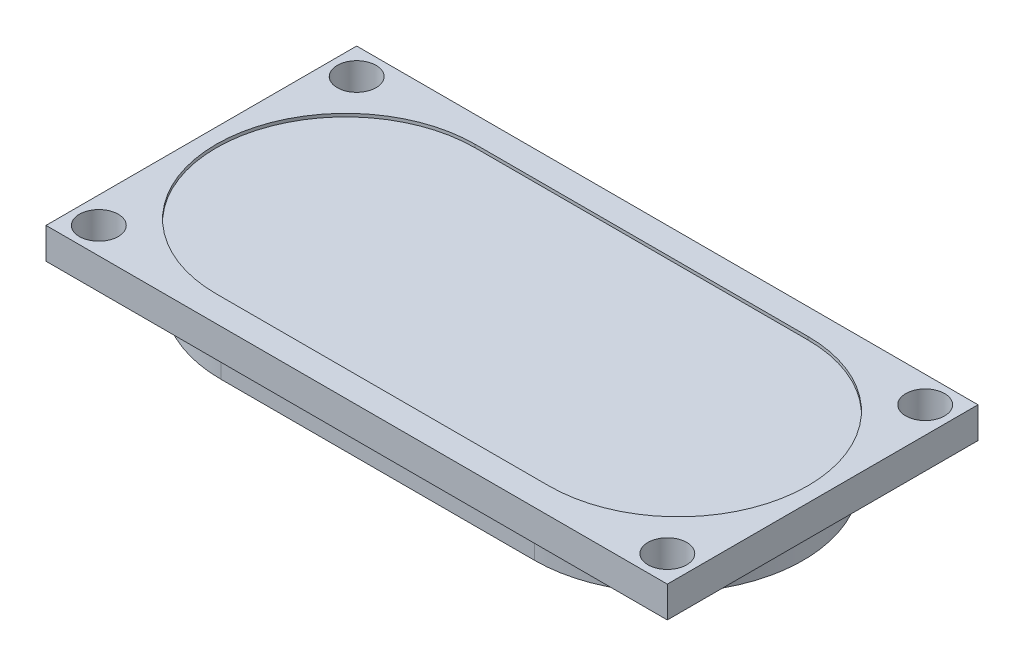
ISO-10303-21;
HEADER;
FILE_DESCRIPTION(('STEP AP214'),'2;1');
FILE_NAME('part.step','',(''),(''),'','','');
FILE_SCHEMA(('AUTOMOTIVE_DESIGN { 1 0 10303 214 1 1 1 1 }'));
ENDSEC;
DATA;
#1=APPLICATION_CONTEXT('core data for automotive mechanical design processes');
#2=APPLICATION_PROTOCOL_DEFINITION('international standard','automotive_design',2000,#1);
#3=PRODUCT_CONTEXT('',#1,'mechanical');
#4=PRODUCT('Part','Part','',(#3));
#5=PRODUCT_RELATED_PRODUCT_CATEGORY('part','',(#4));
#6=PRODUCT_DEFINITION_FORMATION('','',#4);
#7=PRODUCT_DEFINITION_CONTEXT('part definition',#1,'design');
#8=PRODUCT_DEFINITION('design','',#6,#7);
#9=PRODUCT_DEFINITION_SHAPE('','',#8);
#10=(LENGTH_UNIT() NAMED_UNIT(*) SI_UNIT(.MILLI.,.METRE.));
#11=(NAMED_UNIT(*) PLANE_ANGLE_UNIT() SI_UNIT($,.RADIAN.));
#12=(NAMED_UNIT(*) SI_UNIT($,.STERADIAN.) SOLID_ANGLE_UNIT());
#13=UNCERTAINTY_MEASURE_WITH_UNIT(LENGTH_MEASURE(1.E-05),#10,'distance_accuracy_value','');
#14=(GEOMETRIC_REPRESENTATION_CONTEXT(3) GLOBAL_UNCERTAINTY_ASSIGNED_CONTEXT((#13)) GLOBAL_UNIT_ASSIGNED_CONTEXT((#10,
#11,#12)) REPRESENTATION_CONTEXT('',''));
#15=CARTESIAN_POINT('',(0.,0.,0.));
#16=DIRECTION('',(0.,0.,1.));
#17=DIRECTION('',(1.,0.,0.));
#18=AXIS2_PLACEMENT_3D('',#15,#16,#17);
#19=CARTESIAN_POINT('',(0.,0.,0.));
#20=DIRECTION('',(0.,-1.,0.));
#21=DIRECTION('',(0.,0.,-1.));
#22=AXIS2_PLACEMENT_3D('',#19,#20,#21);
#23=PLANE('',#22);
#24=CARTESIAN_POINT('',(18.3,0.,-8.3));
#25=DIRECTION('',(0.,1.,0.));
#26=DIRECTION('',(0.,0.,1.));
#27=AXIS2_PLACEMENT_3D('',#24,#25,#26);
#28=CIRCLE('',#27,1.25);
#29=CARTESIAN_POINT('',(18.3,0.,-7.05));
#30=VERTEX_POINT('',#29);
#31=EDGE_CURVE('E244',#30,#30,#28,.T.);
#32=ORIENTED_EDGE('',*,*,#31,.T.);
#33=EDGE_LOOP('',(#32));
#34=FACE_BOUND('',#33,.T.);
#35=CARTESIAN_POINT('',(-18.3,0.,8.3));
#36=DIRECTION('',(0.,1.,0.));
#37=DIRECTION('',(0.,0.,1.));
#38=AXIS2_PLACEMENT_3D('',#35,#36,#37);
#39=CIRCLE('',#38,1.25);
#40=CARTESIAN_POINT('',(-18.3,0.,9.55));
#41=VERTEX_POINT('',#40);
#42=EDGE_CURVE('E235',#41,#41,#39,.T.);
#43=ORIENTED_EDGE('',*,*,#42,.T.);
#44=EDGE_LOOP('',(#43));
#45=FACE_BOUND('',#44,.T.);
#46=CARTESIAN_POINT('',(18.3,0.,8.3));
#47=DIRECTION('',(0.,1.,0.));
#48=DIRECTION('',(0.,0.,1.));
#49=AXIS2_PLACEMENT_3D('',#46,#47,#48);
#50=CIRCLE('',#49,1.25);
#51=CARTESIAN_POINT('',(18.3,0.,9.55));
#52=VERTEX_POINT('',#51);
#53=EDGE_CURVE('E230',#52,#52,#50,.T.);
#54=ORIENTED_EDGE('',*,*,#53,.T.);
#55=EDGE_LOOP('',(#54));
#56=FACE_BOUND('',#55,.T.);
#57=CARTESIAN_POINT('',(-18.3,0.,-8.3));
#58=DIRECTION('',(0.,1.,0.));
#59=DIRECTION('',(0.,0.,1.));
#60=AXIS2_PLACEMENT_3D('',#57,#58,#59);
#61=CIRCLE('',#60,1.25);
#62=CARTESIAN_POINT('',(-18.3,0.,-7.05));
#63=VERTEX_POINT('',#62);
#64=EDGE_CURVE('E255',#63,#63,#61,.T.);
#65=ORIENTED_EDGE('',*,*,#64,.T.);
#66=EDGE_LOOP('',(#65));
#67=FACE_BOUND('',#66,.T.);
#68=DIRECTION('',(0.,0.,-1.));
#69=VECTOR('',#68,1.);
#70=CARTESIAN_POINT('',(20.,0.,10.));
#71=LINE('',#70,#69);
#72=CARTESIAN_POINT('',(20.,0.,10.));
#73=VERTEX_POINT('',#72);
#74=CARTESIAN_POINT('',(20.,0.,-10.));
#75=VERTEX_POINT('',#74);
#76=EDGE_CURVE('E259',#73,#75,#71,.T.);
#77=ORIENTED_EDGE('',*,*,#76,.F.);
#78=DIRECTION('',(1.,0.,0.));
#79=VECTOR('',#78,1.);
#80=CARTESIAN_POINT('',(-20.,0.,10.));
#81=LINE('',#80,#79);
#82=CARTESIAN_POINT('',(-20.,0.,10.));
#83=VERTEX_POINT('',#82);
#84=EDGE_CURVE('E268',#83,#73,#81,.T.);
#85=ORIENTED_EDGE('',*,*,#84,.F.);
#86=DIRECTION('',(0.,0.,1.));
#87=VECTOR('',#86,1.);
#88=CARTESIAN_POINT('',(-20.,0.,10.));
#89=LINE('',#88,#87);
#90=CARTESIAN_POINT('',(-20.,0.,-10.));
#91=VERTEX_POINT('',#90);
#92=EDGE_CURVE('E284',#91,#83,#89,.T.);
#93=ORIENTED_EDGE('',*,*,#92,.F.);
#94=DIRECTION('',(-1.,0.,0.));
#95=VECTOR('',#94,1.);
#96=CARTESIAN_POINT('',(-20.,0.,-10.));
#97=LINE('',#96,#95);
#98=EDGE_CURVE('E281',#75,#91,#97,.T.);
#99=ORIENTED_EDGE('',*,*,#98,.F.);
#100=EDGE_LOOP('',(#77,#85,#93,#99));
#101=FACE_BOUND('',#100,.T.);
#102=DIRECTION('',(1.,0.,0.));
#103=VECTOR('',#102,1.);
#104=CARTESIAN_POINT('',(-10.1,0.,-8.65));
#105=LINE('',#104,#103);
#106=CARTESIAN_POINT('',(-10.1,0.,-8.65));
#107=VERTEX_POINT('',#106);
#108=CARTESIAN_POINT('',(10.1,0.,-8.65));
#109=VERTEX_POINT('',#108);
#110=EDGE_CURVE('E210',#107,#109,#105,.T.);
#111=ORIENTED_EDGE('',*,*,#110,.F.);
#112=CARTESIAN_POINT('',(-10.1,0.,0.));
#113=DIRECTION('',(0.,-1.,0.));
#114=DIRECTION('',(0.,0.,-1.));
#115=AXIS2_PLACEMENT_3D('',#112,#113,#114);
#116=CIRCLE('',#115,8.65);
#117=CARTESIAN_POINT('',(-10.1,0.,8.65));
#118=VERTEX_POINT('',#117);
#119=EDGE_CURVE('E190',#118,#107,#116,.T.);
#120=ORIENTED_EDGE('',*,*,#119,.F.);
#121=DIRECTION('',(-1.,0.,0.));
#122=VECTOR('',#121,1.);
#123=CARTESIAN_POINT('',(-10.1,0.,8.65));
#124=LINE('',#123,#122);
#125=CARTESIAN_POINT('',(10.1,0.,8.65));
#126=VERTEX_POINT('',#125);
#127=EDGE_CURVE('E197',#126,#118,#124,.T.);
#128=ORIENTED_EDGE('',*,*,#127,.F.);
#129=CARTESIAN_POINT('',(10.1,0.,0.));
#130=DIRECTION('',(0.,-1.,0.));
#131=DIRECTION('',(0.,0.,-1.));
#132=AXIS2_PLACEMENT_3D('',#129,#130,#131);
#133=CIRCLE('',#132,8.65);
#134=EDGE_CURVE('E213',#109,#126,#133,.T.);
#135=ORIENTED_EDGE('',*,*,#134,.F.);
#136=EDGE_LOOP('',(#111,#120,#128,#135));
#137=FACE_BOUND('',#136,.T.);
#138=ADVANCED_FACE('F45',(#34,#45,#56,#67,#101,#137),#23,.T.);
#139=CARTESIAN_POINT('',(20.,2.,10.));
#140=DIRECTION('',(-1.,0.,0.));
#141=DIRECTION('',(0.,0.,1.));
#142=AXIS2_PLACEMENT_3D('',#139,#140,#141);
#143=PLANE('',#142);
#144=ORIENTED_EDGE('',*,*,#76,.T.);
#145=DIRECTION('',(0.,-1.,0.));
#146=VECTOR('',#145,1.);
#147=CARTESIAN_POINT('',(20.,2.,-10.));
#148=LINE('',#147,#146);
#149=CARTESIAN_POINT('',(20.,2.,-10.));
#150=VERTEX_POINT('',#149);
#151=EDGE_CURVE('E49',#150,#75,#148,.T.);
#152=ORIENTED_EDGE('',*,*,#151,.F.);
#153=DIRECTION('',(0.,0.,-1.));
#154=VECTOR('',#153,1.);
#155=CARTESIAN_POINT('',(20.,2.,10.));
#156=LINE('',#155,#154);
#157=CARTESIAN_POINT('',(20.,2.,10.));
#158=VERTEX_POINT('',#157);
#159=EDGE_CURVE('E263',#158,#150,#156,.T.);
#160=ORIENTED_EDGE('',*,*,#159,.F.);
#161=DIRECTION('',(0.,-1.,0.));
#162=VECTOR('',#161,1.);
#163=CARTESIAN_POINT('',(20.,2.,10.));
#164=LINE('',#163,#162);
#165=EDGE_CURVE('E277',#158,#73,#164,.T.);
#166=ORIENTED_EDGE('',*,*,#165,.T.);
#167=EDGE_LOOP('',(#144,#152,#160,#166));
#168=FACE_BOUND('',#167,.T.);
#169=ADVANCED_FACE('F47',(#168),#143,.F.);
#170=CARTESIAN_POINT('',(-20.,2.,-10.));
#171=DIRECTION('',(0.,0.,1.));
#172=DIRECTION('',(1.,0.,0.));
#173=AXIS2_PLACEMENT_3D('',#170,#171,#172);
#174=PLANE('',#173);
#175=ORIENTED_EDGE('',*,*,#98,.T.);
#176=DIRECTION('',(0.,-1.,0.));
#177=VECTOR('',#176,1.);
#178=CARTESIAN_POINT('',(-20.,2.,-10.));
#179=LINE('',#178,#177);
#180=CARTESIAN_POINT('',(-20.,2.,-10.));
#181=VERTEX_POINT('',#180);
#182=EDGE_CURVE('E295',#181,#91,#179,.T.);
#183=ORIENTED_EDGE('',*,*,#182,.F.);
#184=DIRECTION('',(-1.,0.,0.));
#185=VECTOR('',#184,1.);
#186=CARTESIAN_POINT('',(-20.,2.,-10.));
#187=LINE('',#186,#185);
#188=EDGE_CURVE('E267',#150,#181,#187,.T.);
#189=ORIENTED_EDGE('',*,*,#188,.F.);
#190=ORIENTED_EDGE('',*,*,#151,.T.);
#191=EDGE_LOOP('',(#175,#183,#189,#190));
#192=FACE_BOUND('',#191,.T.);
#193=ADVANCED_FACE('F306',(#192),#174,.F.);
#194=CARTESIAN_POINT('',(-20.,2.,10.));
#195=DIRECTION('',(1.,0.,0.));
#196=DIRECTION('',(0.,0.,-1.));
#197=AXIS2_PLACEMENT_3D('',#194,#195,#196);
#198=PLANE('',#197);
#199=ORIENTED_EDGE('',*,*,#92,.T.);
#200=DIRECTION('',(0.,-1.,0.));
#201=VECTOR('',#200,1.);
#202=CARTESIAN_POINT('',(-20.,2.,10.));
#203=LINE('',#202,#201);
#204=CARTESIAN_POINT('',(-20.,2.,10.));
#205=VERTEX_POINT('',#204);
#206=EDGE_CURVE('E292',#205,#83,#203,.T.);
#207=ORIENTED_EDGE('',*,*,#206,.F.);
#208=DIRECTION('',(0.,0.,1.));
#209=VECTOR('',#208,1.);
#210=CARTESIAN_POINT('',(-20.,2.,10.));
#211=LINE('',#210,#209);
#212=EDGE_CURVE('E271',#181,#205,#211,.T.);
#213=ORIENTED_EDGE('',*,*,#212,.F.);
#214=ORIENTED_EDGE('',*,*,#182,.T.);
#215=EDGE_LOOP('',(#199,#207,#213,#214));
#216=FACE_BOUND('',#215,.T.);
#217=ADVANCED_FACE('F315',(#216),#198,.F.);
#218=CARTESIAN_POINT('',(-20.,2.,10.));
#219=DIRECTION('',(0.,0.,-1.));
#220=DIRECTION('',(-1.,0.,0.));
#221=AXIS2_PLACEMENT_3D('',#218,#219,#220);
#222=PLANE('',#221);
#223=ORIENTED_EDGE('',*,*,#84,.T.);
#224=ORIENTED_EDGE('',*,*,#165,.F.);
#225=DIRECTION('',(1.,0.,0.));
#226=VECTOR('',#225,1.);
#227=CARTESIAN_POINT('',(-20.,2.,10.));
#228=LINE('',#227,#226);
#229=EDGE_CURVE('E274',#205,#158,#228,.T.);
#230=ORIENTED_EDGE('',*,*,#229,.F.);
#231=ORIENTED_EDGE('',*,*,#206,.T.);
#232=EDGE_LOOP('',(#223,#224,#230,#231));
#233=FACE_BOUND('',#232,.T.);
#234=ADVANCED_FACE('F318',(#233),#222,.F.);
#235=CARTESIAN_POINT('',(0.,2.,0.));
#236=DIRECTION('',(0.,-1.,0.));
#237=DIRECTION('',(0.,0.,-1.));
#238=AXIS2_PLACEMENT_3D('',#235,#236,#237);
#239=PLANE('',#238);
#240=DIRECTION('',(1.,0.,0.));
#241=VECTOR('',#240,1.);
#242=CARTESIAN_POINT('',(-10.7065687472546,2.,8.33692494745905));
#243=LINE('',#242,#241);
#244=CARTESIAN_POINT('',(-10.7065687472546,2.,8.33692494745905));
#245=VERTEX_POINT('',#244);
#246=CARTESIAN_POINT('',(10.7065687472546,2.,8.33692494745905));
#247=VERTEX_POINT('',#246);
#248=EDGE_CURVE('E173',#245,#247,#243,.T.);
#249=ORIENTED_EDGE('',*,*,#248,.F.);
#250=CARTESIAN_POINT('',(-10.7065687472546,2.,0.));
#251=DIRECTION('',(0.,1.,0.));
#252=DIRECTION('',(0.,0.,1.));
#253=AXIS2_PLACEMENT_3D('',#250,#251,#252);
#254=CIRCLE('',#253,8.33692494745905);
#255=CARTESIAN_POINT('',(-10.7065687472546,2.,-8.33692494745905));
#256=VERTEX_POINT('',#255);
#257=EDGE_CURVE('E62',#256,#245,#254,.T.);
#258=ORIENTED_EDGE('',*,*,#257,.F.);
#259=DIRECTION('',(-1.,0.,0.));
#260=VECTOR('',#259,1.);
#261=CARTESIAN_POINT('',(-10.7065687472546,2.,-8.33692494745905));
#262=LINE('',#261,#260);
#263=CARTESIAN_POINT('',(10.7065687472546,2.,-8.33692494745905));
#264=VERTEX_POINT('',#263);
#265=EDGE_CURVE('E160',#264,#256,#262,.T.);
#266=ORIENTED_EDGE('',*,*,#265,.F.);
#267=CARTESIAN_POINT('',(10.7065687472546,2.,0.));
#268=DIRECTION('',(0.,1.,0.));
#269=DIRECTION('',(0.,0.,1.));
#270=AXIS2_PLACEMENT_3D('',#267,#268,#269);
#271=CIRCLE('',#270,8.33692494745905);
#272=EDGE_CURVE('E164',#247,#264,#271,.T.);
#273=ORIENTED_EDGE('',*,*,#272,.F.);
#274=EDGE_LOOP('',(#249,#258,#266,#273));
#275=FACE_BOUND('',#274,.T.);
#276=CARTESIAN_POINT('',(18.3,2.,-8.3));
#277=DIRECTION('',(0.,1.,0.));
#278=DIRECTION('',(0.,0.,1.));
#279=AXIS2_PLACEMENT_3D('',#276,#277,#278);
#280=CIRCLE('',#279,1.25);
#281=CARTESIAN_POINT('',(18.3,2.,-7.05));
#282=VERTEX_POINT('',#281);
#283=EDGE_CURVE('E239',#282,#282,#280,.T.);
#284=ORIENTED_EDGE('',*,*,#283,.F.);
#285=EDGE_LOOP('',(#284));
#286=FACE_BOUND('',#285,.T.);
#287=CARTESIAN_POINT('',(-18.3,2.,8.3));
#288=DIRECTION('',(0.,1.,0.));
#289=DIRECTION('',(0.,0.,1.));
#290=AXIS2_PLACEMENT_3D('',#287,#288,#289);
#291=CIRCLE('',#290,1.25);
#292=CARTESIAN_POINT('',(-18.3,2.,9.55));
#293=VERTEX_POINT('',#292);
#294=EDGE_CURVE('E248',#293,#293,#291,.T.);
#295=ORIENTED_EDGE('',*,*,#294,.F.);
#296=EDGE_LOOP('',(#295));
#297=FACE_BOUND('',#296,.T.);
#298=CARTESIAN_POINT('',(18.3,2.,8.3));
#299=DIRECTION('',(0.,1.,0.));
#300=DIRECTION('',(0.,0.,1.));
#301=AXIS2_PLACEMENT_3D('',#298,#299,#300);
#302=CIRCLE('',#301,1.25);
#303=CARTESIAN_POINT('',(18.3,2.,9.55));
#304=VERTEX_POINT('',#303);
#305=EDGE_CURVE('E231',#304,#304,#302,.T.);
#306=ORIENTED_EDGE('',*,*,#305,.F.);
#307=EDGE_LOOP('',(#306));
#308=FACE_BOUND('',#307,.T.);
#309=CARTESIAN_POINT('',(-18.3,2.,-8.3));
#310=DIRECTION('',(0.,1.,0.));
#311=DIRECTION('',(0.,0.,1.));
#312=AXIS2_PLACEMENT_3D('',#309,#310,#311);
#313=CIRCLE('',#312,1.25);
#314=CARTESIAN_POINT('',(-18.3,2.,-7.05));
#315=VERTEX_POINT('',#314);
#316=EDGE_CURVE('E243',#315,#315,#313,.T.);
#317=ORIENTED_EDGE('',*,*,#316,.F.);
#318=EDGE_LOOP('',(#317));
#319=FACE_BOUND('',#318,.T.);
#320=ORIENTED_EDGE('',*,*,#159,.T.);
#321=ORIENTED_EDGE('',*,*,#188,.T.);
#322=ORIENTED_EDGE('',*,*,#212,.T.);
#323=ORIENTED_EDGE('',*,*,#229,.T.);
#324=EDGE_LOOP('',(#320,#321,#322,#323));
#325=FACE_BOUND('',#324,.T.);
#326=ADVANCED_FACE('F320',(#275,#286,#297,#308,#319,#325),#239,.F.);
#327=CARTESIAN_POINT('',(-18.3,0.,-8.3));
#328=DIRECTION('',(0.,1.,0.));
#329=DIRECTION('',(0.,0.,1.));
#330=AXIS2_PLACEMENT_3D('',#327,#328,#329);
#331=CYLINDRICAL_SURFACE('',#330,1.25);
#332=ORIENTED_EDGE('',*,*,#64,.F.);
#333=EDGE_LOOP('',(#332));
#334=FACE_BOUND('',#333,.T.);
#335=ORIENTED_EDGE('',*,*,#316,.T.);
#336=EDGE_LOOP('',(#335));
#337=FACE_BOUND('',#336,.T.);
#338=ADVANCED_FACE('F322',(#334,#337),#331,.F.);
#339=CARTESIAN_POINT('',(18.3,0.,8.3));
#340=DIRECTION('',(0.,1.,0.));
#341=DIRECTION('',(0.,0.,1.));
#342=AXIS2_PLACEMENT_3D('',#339,#340,#341);
#343=CYLINDRICAL_SURFACE('',#342,1.25);
#344=ORIENTED_EDGE('',*,*,#53,.F.);
#345=EDGE_LOOP('',(#344));
#346=FACE_BOUND('',#345,.T.);
#347=ORIENTED_EDGE('',*,*,#305,.T.);
#348=EDGE_LOOP('',(#347));
#349=FACE_BOUND('',#348,.T.);
#350=ADVANCED_FACE('F330',(#346,#349),#343,.F.);
#351=CARTESIAN_POINT('',(-18.3,0.,8.3));
#352=DIRECTION('',(0.,1.,0.));
#353=DIRECTION('',(0.,0.,1.));
#354=AXIS2_PLACEMENT_3D('',#351,#352,#353);
#355=CYLINDRICAL_SURFACE('',#354,1.25);
#356=ORIENTED_EDGE('',*,*,#42,.F.);
#357=EDGE_LOOP('',(#356));
#358=FACE_BOUND('',#357,.T.);
#359=ORIENTED_EDGE('',*,*,#294,.T.);
#360=EDGE_LOOP('',(#359));
#361=FACE_BOUND('',#360,.T.);
#362=ADVANCED_FACE('F374',(#358,#361),#355,.F.);
#363=CARTESIAN_POINT('',(18.3,0.,-8.3));
#364=DIRECTION('',(0.,1.,0.));
#365=DIRECTION('',(0.,0.,1.));
#366=AXIS2_PLACEMENT_3D('',#363,#364,#365);
#367=CYLINDRICAL_SURFACE('',#366,1.25);
#368=ORIENTED_EDGE('',*,*,#31,.F.);
#369=EDGE_LOOP('',(#368));
#370=FACE_BOUND('',#369,.T.);
#371=ORIENTED_EDGE('',*,*,#283,.T.);
#372=EDGE_LOOP('',(#371));
#373=FACE_BOUND('',#372,.T.);
#374=ADVANCED_FACE('F382',(#370,#373),#367,.F.);
#375=CARTESIAN_POINT('',(-10.1,-2.3,0.));
#376=DIRECTION('',(0.,1.,0.));
#377=DIRECTION('',(0.,0.,1.));
#378=AXIS2_PLACEMENT_3D('',#375,#376,#377);
#379=CYLINDRICAL_SURFACE('',#378,8.65);
#380=ORIENTED_EDGE('',*,*,#119,.T.);
#381=DIRECTION('',(0.,1.,0.));
#382=VECTOR('',#381,1.);
#383=CARTESIAN_POINT('',(-10.1,-2.3,-8.65));
#384=LINE('',#383,#382);
#385=CARTESIAN_POINT('',(-10.1,-2.3,-8.65));
#386=VERTEX_POINT('',#385);
#387=EDGE_CURVE('E227',#386,#107,#384,.T.);
#388=ORIENTED_EDGE('',*,*,#387,.F.);
#389=CARTESIAN_POINT('',(-10.1,-2.3,0.));
#390=DIRECTION('',(0.,-1.,0.));
#391=DIRECTION('',(0.,0.,-1.));
#392=AXIS2_PLACEMENT_3D('',#389,#390,#391);
#393=CIRCLE('',#392,8.65);
#394=CARTESIAN_POINT('',(-10.1,-2.3,8.65));
#395=VERTEX_POINT('',#394);
#396=EDGE_CURVE('E192',#395,#386,#393,.T.);
#397=ORIENTED_EDGE('',*,*,#396,.F.);
#398=DIRECTION('',(0.,1.,0.));
#399=VECTOR('',#398,1.);
#400=CARTESIAN_POINT('',(-10.1,-2.3,8.65));
#401=LINE('',#400,#399);
#402=EDGE_CURVE('E206',#395,#118,#401,.T.);
#403=ORIENTED_EDGE('',*,*,#402,.T.);
#404=EDGE_LOOP('',(#380,#388,#397,#403));
#405=FACE_BOUND('',#404,.T.);
#406=ADVANCED_FACE('F390',(#405),#379,.T.);
#407=CARTESIAN_POINT('',(-10.1,-2.3,-8.65));
#408=DIRECTION('',(0.,0.,1.));
#409=DIRECTION('',(1.,0.,0.));
#410=AXIS2_PLACEMENT_3D('',#407,#408,#409);
#411=PLANE('',#410);
#412=ORIENTED_EDGE('',*,*,#110,.T.);
#413=DIRECTION('',(0.,1.,0.));
#414=VECTOR('',#413,1.);
#415=CARTESIAN_POINT('',(10.1,-2.3,-8.65));
#416=LINE('',#415,#414);
#417=CARTESIAN_POINT('',(10.1,-2.3,-8.65));
#418=VERTEX_POINT('',#417);
#419=EDGE_CURVE('E223',#418,#109,#416,.T.);
#420=ORIENTED_EDGE('',*,*,#419,.F.);
#421=DIRECTION('',(1.,0.,0.));
#422=VECTOR('',#421,1.);
#423=CARTESIAN_POINT('',(-10.1,-2.3,-8.65));
#424=LINE('',#423,#422);
#425=EDGE_CURVE('E196',#386,#418,#424,.T.);
#426=ORIENTED_EDGE('',*,*,#425,.F.);
#427=ORIENTED_EDGE('',*,*,#387,.T.);
#428=EDGE_LOOP('',(#412,#420,#426,#427));
#429=FACE_BOUND('',#428,.T.);
#430=ADVANCED_FACE('F406',(#429),#411,.F.);
#431=CARTESIAN_POINT('',(10.1,-2.3,0.));
#432=DIRECTION('',(0.,1.,0.));
#433=DIRECTION('',(0.,0.,1.));
#434=AXIS2_PLACEMENT_3D('',#431,#432,#433);
#435=CYLINDRICAL_SURFACE('',#434,8.65);
#436=ORIENTED_EDGE('',*,*,#134,.T.);
#437=DIRECTION('',(0.,1.,0.));
#438=VECTOR('',#437,1.);
#439=CARTESIAN_POINT('',(10.1,-2.3,8.65));
#440=LINE('',#439,#438);
#441=CARTESIAN_POINT('',(10.1,-2.3,8.65));
#442=VERTEX_POINT('',#441);
#443=EDGE_CURVE('E70',#442,#126,#440,.T.);
#444=ORIENTED_EDGE('',*,*,#443,.F.);
#445=CARTESIAN_POINT('',(10.1,-2.3,0.));
#446=DIRECTION('',(0.,-1.,0.));
#447=DIRECTION('',(0.,0.,-1.));
#448=AXIS2_PLACEMENT_3D('',#445,#446,#447);
#449=CIRCLE('',#448,8.65);
#450=EDGE_CURVE('E200',#418,#442,#449,.T.);
#451=ORIENTED_EDGE('',*,*,#450,.F.);
#452=ORIENTED_EDGE('',*,*,#419,.T.);
#453=EDGE_LOOP('',(#436,#444,#451,#452));
#454=FACE_BOUND('',#453,.T.);
#455=ADVANCED_FACE('F416',(#454),#435,.T.);
#456=CARTESIAN_POINT('',(-10.1,-2.3,8.65));
#457=DIRECTION('',(0.,0.,-1.));
#458=DIRECTION('',(-1.,0.,0.));
#459=AXIS2_PLACEMENT_3D('',#456,#457,#458);
#460=PLANE('',#459);
#461=ORIENTED_EDGE('',*,*,#127,.T.);
#462=ORIENTED_EDGE('',*,*,#402,.F.);
#463=DIRECTION('',(-1.,0.,0.));
#464=VECTOR('',#463,1.);
#465=CARTESIAN_POINT('',(-10.1,-2.3,8.65));
#466=LINE('',#465,#464);
#467=EDGE_CURVE('E203',#442,#395,#466,.T.);
#468=ORIENTED_EDGE('',*,*,#467,.F.);
#469=ORIENTED_EDGE('',*,*,#443,.T.);
#470=EDGE_LOOP('',(#461,#462,#468,#469));
#471=FACE_BOUND('',#470,.T.);
#472=ADVANCED_FACE('F426',(#471),#460,.F.);
#473=CARTESIAN_POINT('',(-10.1,-2.3,0.));
#474=DIRECTION('',(0.,-1.,0.));
#475=DIRECTION('',(0.,0.,-1.));
#476=AXIS2_PLACEMENT_3D('',#473,#474,#475);
#477=PLANE('',#476);
#478=CARTESIAN_POINT('',(0.,-2.3,0.));
#479=DIRECTION('',(0.,-1.,0.));
#480=DIRECTION('',(0.,0.,-1.));
#481=AXIS2_PLACEMENT_3D('',#478,#479,#480);
#482=CIRCLE('',#481,7.25);
#483=CARTESIAN_POINT('',(0.,-2.3,-7.25));
#484=VERTEX_POINT('',#483);
#485=EDGE_CURVE('E11',#484,#484,#482,.T.);
#486=ORIENTED_EDGE('',*,*,#485,.F.);
#487=EDGE_LOOP('',(#486));
#488=FACE_BOUND('',#487,.T.);
#489=ORIENTED_EDGE('',*,*,#396,.T.);
#490=ORIENTED_EDGE('',*,*,#425,.T.);
#491=ORIENTED_EDGE('',*,*,#450,.T.);
#492=ORIENTED_EDGE('',*,*,#467,.T.);
#493=EDGE_LOOP('',(#489,#490,#491,#492));
#494=FACE_BOUND('',#493,.T.);
#495=ADVANCED_FACE('F436',(#488,#494),#477,.T.);
#496=CARTESIAN_POINT('',(0.,-3.5,0.));
#497=DIRECTION('',(0.,1.,0.));
#498=DIRECTION('',(0.,0.,1.));
#499=AXIS2_PLACEMENT_3D('',#496,#497,#498);
#500=CYLINDRICAL_SURFACE('',#499,7.25);
#501=CARTESIAN_POINT('',(0.,-3.5,0.));
#502=DIRECTION('',(0.,-1.,0.));
#503=DIRECTION('',(0.,0.,-1.));
#504=AXIS2_PLACEMENT_3D('',#501,#502,#503);
#505=CIRCLE('',#504,7.25);
#506=CARTESIAN_POINT('',(0.,-3.5,-7.25));
#507=VERTEX_POINT('',#506);
#508=EDGE_CURVE('E182',#507,#507,#505,.T.);
#509=ORIENTED_EDGE('',*,*,#508,.F.);
#510=EDGE_LOOP('',(#509));
#511=FACE_BOUND('',#510,.T.);
#512=ORIENTED_EDGE('',*,*,#485,.T.);
#513=EDGE_LOOP('',(#512));
#514=FACE_BOUND('',#513,.T.);
#515=ADVANCED_FACE('F445',(#511,#514),#500,.T.);
#516=CARTESIAN_POINT('',(0.,-3.5,0.));
#517=DIRECTION('',(0.,-1.,0.));
#518=DIRECTION('',(0.,0.,-1.));
#519=AXIS2_PLACEMENT_3D('',#516,#517,#518);
#520=PLANE('',#519);
#521=ORIENTED_EDGE('',*,*,#508,.T.);
#522=EDGE_LOOP('',(#521));
#523=FACE_BOUND('',#522,.T.);
#524=ADVANCED_FACE('F455',(#523),#520,.T.);
#525=CARTESIAN_POINT('',(-10.7065687472546,1.8,0.));
#526=DIRECTION('',(0.,1.,0.));
#527=DIRECTION('',(0.,0.,1.));
#528=AXIS2_PLACEMENT_3D('',#525,#526,#527);
#529=CYLINDRICAL_SURFACE('',#528,8.33692494745905);
#530=ORIENTED_EDGE('',*,*,#257,.T.);
#531=DIRECTION('',(0.,1.,0.));
#532=VECTOR('',#531,1.);
#533=CARTESIAN_POINT('',(-10.7065687472546,1.8,8.33692494745905));
#534=LINE('',#533,#532);
#535=CARTESIAN_POINT('',(-10.7065687472546,1.8,8.33692494745905));
#536=VERTEX_POINT('',#535);
#537=EDGE_CURVE('E135',#536,#245,#534,.T.);
#538=ORIENTED_EDGE('',*,*,#537,.F.);
#539=CARTESIAN_POINT('',(-10.7065687472546,1.8,0.));
#540=DIRECTION('',(0.,1.,0.));
#541=DIRECTION('',(0.,0.,1.));
#542=AXIS2_PLACEMENT_3D('',#539,#540,#541);
#543=CIRCLE('',#542,8.33692494745905);
#544=CARTESIAN_POINT('',(-10.7065687472546,1.8,-8.33692494745905));
#545=VERTEX_POINT('',#544);
#546=EDGE_CURVE('E139',#545,#536,#543,.T.);
#547=ORIENTED_EDGE('',*,*,#546,.F.);
#548=DIRECTION('',(0.,1.,0.));
#549=VECTOR('',#548,1.);
#550=CARTESIAN_POINT('',(-10.7065687472546,1.8,-8.33692494745905));
#551=LINE('',#550,#549);
#552=EDGE_CURVE('E179',#545,#256,#551,.T.);
#553=ORIENTED_EDGE('',*,*,#552,.T.);
#554=EDGE_LOOP('',(#530,#538,#547,#553));
#555=FACE_BOUND('',#554,.T.);
#556=ADVANCED_FACE('F137',(#555),#529,.F.);
#557=CARTESIAN_POINT('',(-10.7065687472546,1.8,-8.33692494745905));
#558=DIRECTION('',(0.,0.,-1.));
#559=DIRECTION('',(-1.,0.,0.));
#560=AXIS2_PLACEMENT_3D('',#557,#558,#559);
#561=PLANE('',#560);
#562=ORIENTED_EDGE('',*,*,#265,.T.);
#563=ORIENTED_EDGE('',*,*,#552,.F.);
#564=DIRECTION('',(-1.,0.,0.));
#565=VECTOR('',#564,1.);
#566=CARTESIAN_POINT('',(-10.7065687472546,1.8,-8.33692494745905));
#567=LINE('',#566,#565);
#568=CARTESIAN_POINT('',(10.7065687472546,1.8,-8.33692494745905));
#569=VERTEX_POINT('',#568);
#570=EDGE_CURVE('E146',#569,#545,#567,.T.);
#571=ORIENTED_EDGE('',*,*,#570,.F.);
#572=DIRECTION('',(0.,1.,0.));
#573=VECTOR('',#572,1.);
#574=CARTESIAN_POINT('',(10.7065687472546,1.8,-8.33692494745905));
#575=LINE('',#574,#573);
#576=EDGE_CURVE('E183',#569,#264,#575,.T.);
#577=ORIENTED_EDGE('',*,*,#576,.T.);
#578=EDGE_LOOP('',(#562,#563,#571,#577));
#579=FACE_BOUND('',#578,.T.);
#580=ADVANCED_FACE('F472',(#579),#561,.F.);
#581=CARTESIAN_POINT('',(10.7065687472546,1.8,0.));
#582=DIRECTION('',(0.,1.,0.));
#583=DIRECTION('',(0.,0.,1.));
#584=AXIS2_PLACEMENT_3D('',#581,#582,#583);
#585=CYLINDRICAL_SURFACE('',#584,8.33692494745905);
#586=ORIENTED_EDGE('',*,*,#272,.T.);
#587=ORIENTED_EDGE('',*,*,#576,.F.);
#588=CARTESIAN_POINT('',(10.7065687472546,1.8,0.));
#589=DIRECTION('',(0.,1.,0.));
#590=DIRECTION('',(0.,0.,1.));
#591=AXIS2_PLACEMENT_3D('',#588,#589,#590);
#592=CIRCLE('',#591,8.33692494745905);
#593=CARTESIAN_POINT('',(10.7065687472546,1.8,8.33692494745905));
#594=VERTEX_POINT('',#593);
#595=EDGE_CURVE('E155',#594,#569,#592,.T.);
#596=ORIENTED_EDGE('',*,*,#595,.F.);
#597=DIRECTION('',(0.,1.,0.));
#598=VECTOR('',#597,1.);
#599=CARTESIAN_POINT('',(10.7065687472546,1.8,8.33692494745905));
#600=LINE('',#599,#598);
#601=EDGE_CURVE('E145',#594,#247,#600,.T.);
#602=ORIENTED_EDGE('',*,*,#601,.T.);
#603=EDGE_LOOP('',(#586,#587,#596,#602));
#604=FACE_BOUND('',#603,.T.);
#605=ADVANCED_FACE('F481',(#604),#585,.F.);
#606=CARTESIAN_POINT('',(-10.7065687472546,1.8,8.33692494745905));
#607=DIRECTION('',(0.,0.,1.));
#608=DIRECTION('',(1.,0.,0.));
#609=AXIS2_PLACEMENT_3D('',#606,#607,#608);
#610=PLANE('',#609);
#611=ORIENTED_EDGE('',*,*,#248,.T.);
#612=ORIENTED_EDGE('',*,*,#601,.F.);
#613=DIRECTION('',(1.,0.,0.));
#614=VECTOR('',#613,1.);
#615=CARTESIAN_POINT('',(-10.7065687472546,1.8,8.33692494745905));
#616=LINE('',#615,#614);
#617=EDGE_CURVE('E149',#536,#594,#616,.T.);
#618=ORIENTED_EDGE('',*,*,#617,.F.);
#619=ORIENTED_EDGE('',*,*,#537,.T.);
#620=EDGE_LOOP('',(#611,#612,#618,#619));
#621=FACE_BOUND('',#620,.T.);
#622=ADVANCED_FACE('F150',(#621),#610,.F.);
#623=CARTESIAN_POINT('',(-10.7065687472546,1.8,0.));
#624=DIRECTION('',(0.,1.,0.));
#625=DIRECTION('',(0.,0.,1.));
#626=AXIS2_PLACEMENT_3D('',#623,#624,#625);
#627=PLANE('',#626);
#628=ORIENTED_EDGE('',*,*,#546,.T.);
#629=ORIENTED_EDGE('',*,*,#617,.T.);
#630=ORIENTED_EDGE('',*,*,#595,.T.);
#631=ORIENTED_EDGE('',*,*,#570,.T.);
#632=EDGE_LOOP('',(#628,#629,#630,#631));
#633=FACE_BOUND('',#632,.T.);
#634=ADVANCED_FACE('F157',(#633),#627,.T.);
#635=CLOSED_SHELL('',(#138,#169,#193,#217,#234,#326,#338,#350,#362,#374,#406,#430,#455,#472,
#495,#515,#524,#556,#580,#605,#622,#634));
#636=MANIFOLD_SOLID_BREP('B2',#635);
#637=ADVANCED_BREP_SHAPE_REPRESENTATION('',(#18,#636),#14);
#638=SHAPE_DEFINITION_REPRESENTATION(#9,#637);
ENDSEC;
END-ISO-10303-21;
